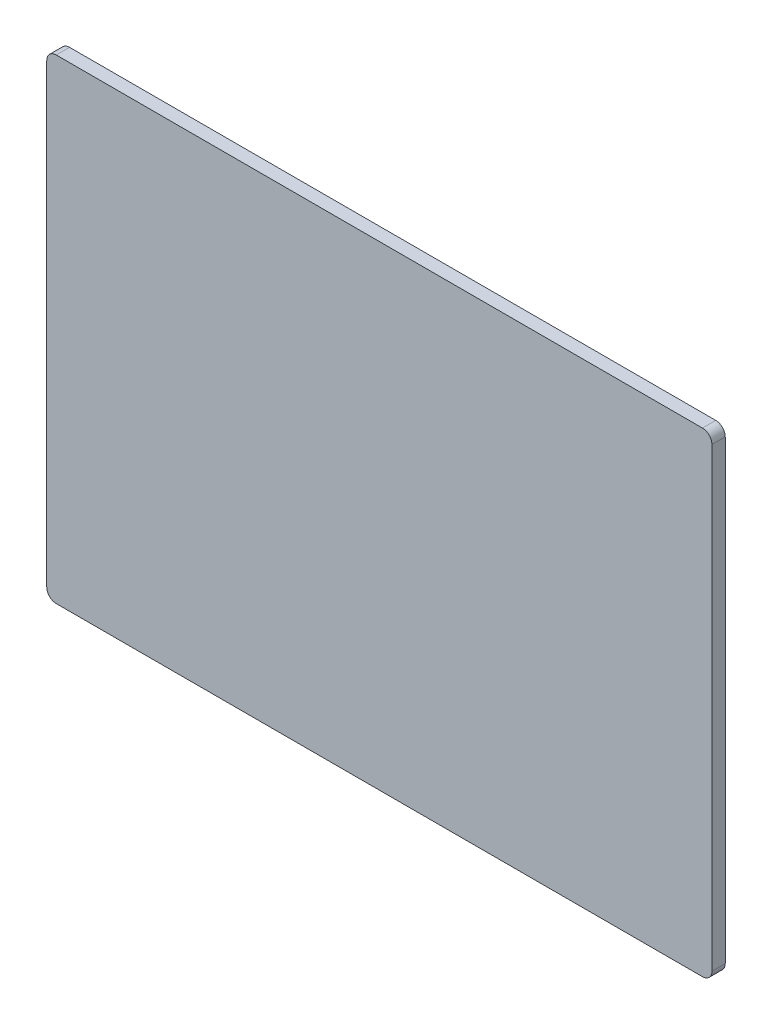
ISO-10303-21;
HEADER;
FILE_DESCRIPTION(('STEP AP214'),'2;1');
FILE_NAME('part.step','',(''),(''),'','','');
FILE_SCHEMA(('AUTOMOTIVE_DESIGN { 1 0 10303 214 1 1 1 1 }'));
ENDSEC;
DATA;
#1=APPLICATION_CONTEXT('core data for automotive mechanical design processes');
#2=APPLICATION_PROTOCOL_DEFINITION('international standard','automotive_design',2000,#1);
#3=PRODUCT_CONTEXT('',#1,'mechanical');
#4=PRODUCT('Part','Part','',(#3));
#5=PRODUCT_RELATED_PRODUCT_CATEGORY('part','',(#4));
#6=PRODUCT_DEFINITION_FORMATION('','',#4);
#7=PRODUCT_DEFINITION_CONTEXT('part definition',#1,'design');
#8=PRODUCT_DEFINITION('design','',#6,#7);
#9=PRODUCT_DEFINITION_SHAPE('','',#8);
#10=(LENGTH_UNIT() NAMED_UNIT(*) SI_UNIT(.MILLI.,.METRE.));
#11=(NAMED_UNIT(*) PLANE_ANGLE_UNIT() SI_UNIT($,.RADIAN.));
#12=(NAMED_UNIT(*) SI_UNIT($,.STERADIAN.) SOLID_ANGLE_UNIT());
#13=UNCERTAINTY_MEASURE_WITH_UNIT(LENGTH_MEASURE(1.E-05),#10,'distance_accuracy_value','');
#14=(GEOMETRIC_REPRESENTATION_CONTEXT(3) GLOBAL_UNCERTAINTY_ASSIGNED_CONTEXT((#13)) GLOBAL_UNIT_ASSIGNED_CONTEXT((#10,
#11,#12)) REPRESENTATION_CONTEXT('',''));
#15=CARTESIAN_POINT('',(0.,0.,0.));
#16=DIRECTION('',(0.,0.,1.));
#17=DIRECTION('',(1.,0.,0.));
#18=AXIS2_PLACEMENT_3D('',#15,#16,#17);
#19=CARTESIAN_POINT('',(-175.,-125.,7.));
#20=DIRECTION('',(1.,0.,0.));
#21=DIRECTION('',(0.,0.,-1.));
#22=AXIS2_PLACEMENT_3D('',#19,#20,#21);
#23=PLANE('',#22);
#24=DIRECTION('',(0.,-1.,0.));
#25=VECTOR('',#24,1.);
#26=CARTESIAN_POINT('',(-175.,-125.,0.));
#27=LINE('',#26,#25);
#28=CARTESIAN_POINT('',(-175.,120.,0.));
#29=VERTEX_POINT('',#28);
#30=CARTESIAN_POINT('',(-175.,-120.,0.));
#31=VERTEX_POINT('',#30);
#32=EDGE_CURVE('E127',#29,#31,#27,.T.);
#33=ORIENTED_EDGE('',*,*,#32,.T.);
#34=DIRECTION('',(0.,0.,-1.));
#35=VECTOR('',#34,1.);
#36=CARTESIAN_POINT('',(-175.,-120.,7.));
#37=LINE('',#36,#35);
#38=CARTESIAN_POINT('',(-175.,-120.,7.));
#39=VERTEX_POINT('',#38);
#40=EDGE_CURVE('E150',#31,#39,#37,.F.);
#41=ORIENTED_EDGE('',*,*,#40,.T.);
#42=DIRECTION('',(0.,-1.,0.));
#43=VECTOR('',#42,1.);
#44=CARTESIAN_POINT('',(-175.,-125.,7.));
#45=LINE('',#44,#43);
#46=CARTESIAN_POINT('',(-175.,120.,7.));
#47=VERTEX_POINT('',#46);
#48=EDGE_CURVE('E125',#47,#39,#45,.T.);
#49=ORIENTED_EDGE('',*,*,#48,.F.);
#50=DIRECTION('',(0.,0.,-1.));
#51=VECTOR('',#50,1.);
#52=CARTESIAN_POINT('',(-175.,120.,7.));
#53=LINE('',#52,#51);
#54=EDGE_CURVE('E147',#47,#29,#53,.T.);
#55=ORIENTED_EDGE('',*,*,#54,.T.);
#56=EDGE_LOOP('',(#33,#41,#49,#55));
#57=FACE_BOUND('',#56,.T.);
#58=ADVANCED_FACE('F32',(#57),#23,.F.);
#59=CARTESIAN_POINT('',(175.,-125.,7.));
#60=DIRECTION('',(0.,1.,0.));
#61=DIRECTION('',(-1.,0.,0.));
#62=AXIS2_PLACEMENT_3D('',#59,#60,#61);
#63=PLANE('',#62);
#64=DIRECTION('',(1.,0.,0.));
#65=VECTOR('',#64,1.);
#66=CARTESIAN_POINT('',(175.,-125.,0.));
#67=LINE('',#66,#65);
#68=CARTESIAN_POINT('',(-170.,-125.,0.));
#69=VERTEX_POINT('',#68);
#70=CARTESIAN_POINT('',(170.,-125.,0.));
#71=VERTEX_POINT('',#70);
#72=EDGE_CURVE('E123',#69,#71,#67,.T.);
#73=ORIENTED_EDGE('',*,*,#72,.T.);
#74=DIRECTION('',(0.,0.,-1.));
#75=VECTOR('',#74,1.);
#76=CARTESIAN_POINT('',(170.,-125.,7.));
#77=LINE('',#76,#75);
#78=CARTESIAN_POINT('',(170.,-125.,7.));
#79=VERTEX_POINT('',#78);
#80=EDGE_CURVE('E102',#71,#79,#77,.F.);
#81=ORIENTED_EDGE('',*,*,#80,.T.);
#82=DIRECTION('',(1.,0.,0.));
#83=VECTOR('',#82,1.);
#84=CARTESIAN_POINT('',(175.,-125.,7.));
#85=LINE('',#84,#83);
#86=CARTESIAN_POINT('',(-170.,-125.,7.));
#87=VERTEX_POINT('',#86);
#88=EDGE_CURVE('E166',#87,#79,#85,.T.);
#89=ORIENTED_EDGE('',*,*,#88,.F.);
#90=DIRECTION('',(0.,0.,-1.));
#91=VECTOR('',#90,1.);
#92=CARTESIAN_POINT('',(-170.,-125.,7.));
#93=LINE('',#92,#91);
#94=EDGE_CURVE('E107',#87,#69,#93,.T.);
#95=ORIENTED_EDGE('',*,*,#94,.T.);
#96=EDGE_LOOP('',(#73,#81,#89,#95));
#97=FACE_BOUND('',#96,.T.);
#98=ADVANCED_FACE('F183',(#97),#63,.F.);
#99=CARTESIAN_POINT('',(175.,-125.,7.));
#100=DIRECTION('',(-1.,0.,0.));
#101=DIRECTION('',(0.,0.,1.));
#102=AXIS2_PLACEMENT_3D('',#99,#100,#101);
#103=PLANE('',#102);
#104=DIRECTION('',(0.,1.,0.));
#105=VECTOR('',#104,1.);
#106=CARTESIAN_POINT('',(175.,-125.,7.));
#107=LINE('',#106,#105);
#108=CARTESIAN_POINT('',(175.,-120.,7.));
#109=VERTEX_POINT('',#108);
#110=CARTESIAN_POINT('',(175.,120.,7.));
#111=VERTEX_POINT('',#110);
#112=EDGE_CURVE('E116',#109,#111,#107,.T.);
#113=ORIENTED_EDGE('',*,*,#112,.F.);
#114=DIRECTION('',(0.,0.,-1.));
#115=VECTOR('',#114,1.);
#116=CARTESIAN_POINT('',(175.,-120.,7.));
#117=LINE('',#116,#115);
#118=CARTESIAN_POINT('',(175.,-120.,0.));
#119=VERTEX_POINT('',#118);
#120=EDGE_CURVE('E101',#109,#119,#117,.T.);
#121=ORIENTED_EDGE('',*,*,#120,.T.);
#122=DIRECTION('',(0.,1.,0.));
#123=VECTOR('',#122,1.);
#124=CARTESIAN_POINT('',(175.,-125.,0.));
#125=LINE('',#124,#123);
#126=CARTESIAN_POINT('',(175.,120.,0.));
#127=VERTEX_POINT('',#126);
#128=EDGE_CURVE('E114',#119,#127,#125,.T.);
#129=ORIENTED_EDGE('',*,*,#128,.T.);
#130=DIRECTION('',(0.,0.,-1.));
#131=VECTOR('',#130,1.);
#132=CARTESIAN_POINT('',(175.,120.,7.));
#133=LINE('',#132,#131);
#134=EDGE_CURVE('E118',#127,#111,#133,.F.);
#135=ORIENTED_EDGE('',*,*,#134,.T.);
#136=EDGE_LOOP('',(#113,#121,#129,#135));
#137=FACE_BOUND('',#136,.T.);
#138=ADVANCED_FACE('F113',(#137),#103,.F.);
#139=CARTESIAN_POINT('',(175.,125.,7.));
#140=DIRECTION('',(0.,-1.,0.));
#141=DIRECTION('',(1.,0.,0.));
#142=AXIS2_PLACEMENT_3D('',#139,#140,#141);
#143=PLANE('',#142);
#144=DIRECTION('',(-1.,0.,0.));
#145=VECTOR('',#144,1.);
#146=CARTESIAN_POINT('',(175.,125.,0.));
#147=LINE('',#146,#145);
#148=CARTESIAN_POINT('',(170.,125.,0.));
#149=VERTEX_POINT('',#148);
#150=CARTESIAN_POINT('',(-170.,125.,0.));
#151=VERTEX_POINT('',#150);
#152=EDGE_CURVE('E122',#149,#151,#147,.T.);
#153=ORIENTED_EDGE('',*,*,#152,.T.);
#154=DIRECTION('',(0.,0.,-1.));
#155=VECTOR('',#154,1.);
#156=CARTESIAN_POINT('',(-170.,125.,7.));
#157=LINE('',#156,#155);
#158=CARTESIAN_POINT('',(-170.,125.,7.));
#159=VERTEX_POINT('',#158);
#160=EDGE_CURVE('E11',#151,#159,#157,.F.);
#161=ORIENTED_EDGE('',*,*,#160,.T.);
#162=DIRECTION('',(-1.,0.,0.));
#163=VECTOR('',#162,1.);
#164=CARTESIAN_POINT('',(175.,125.,7.));
#165=LINE('',#164,#163);
#166=CARTESIAN_POINT('',(170.,125.,7.));
#167=VERTEX_POINT('',#166);
#168=EDGE_CURVE('E131',#167,#159,#165,.T.);
#169=ORIENTED_EDGE('',*,*,#168,.F.);
#170=DIRECTION('',(0.,0.,-1.));
#171=VECTOR('',#170,1.);
#172=CARTESIAN_POINT('',(170.,125.,7.));
#173=LINE('',#172,#171);
#174=EDGE_CURVE('E40',#167,#149,#173,.T.);
#175=ORIENTED_EDGE('',*,*,#174,.T.);
#176=EDGE_LOOP('',(#153,#161,#169,#175));
#177=FACE_BOUND('',#176,.T.);
#178=ADVANCED_FACE('F153',(#177),#143,.F.);
#179=CARTESIAN_POINT('',(0.,0.,7.));
#180=DIRECTION('',(0.,0.,1.));
#181=DIRECTION('',(1.,0.,0.));
#182=AXIS2_PLACEMENT_3D('',#179,#180,#181);
#183=PLANE('',#182);
#184=ORIENTED_EDGE('',*,*,#88,.T.);
#185=CARTESIAN_POINT('',(170.,-120.,7.));
#186=DIRECTION('',(0.,0.,1.));
#187=DIRECTION('',(1.,0.,0.));
#188=AXIS2_PLACEMENT_3D('',#185,#186,#187);
#189=CIRCLE('',#188,5.);
#190=EDGE_CURVE('E145',#79,#109,#189,.T.);
#191=ORIENTED_EDGE('',*,*,#190,.T.);
#192=ORIENTED_EDGE('',*,*,#112,.T.);
#193=CARTESIAN_POINT('',(170.,120.,7.));
#194=DIRECTION('',(0.,0.,1.));
#195=DIRECTION('',(1.,0.,0.));
#196=AXIS2_PLACEMENT_3D('',#193,#194,#195);
#197=CIRCLE('',#196,5.);
#198=EDGE_CURVE('E52',#111,#167,#197,.T.);
#199=ORIENTED_EDGE('',*,*,#198,.T.);
#200=ORIENTED_EDGE('',*,*,#168,.T.);
#201=CARTESIAN_POINT('',(-170.,120.,7.));
#202=DIRECTION('',(0.,0.,1.));
#203=DIRECTION('',(1.,0.,0.));
#204=AXIS2_PLACEMENT_3D('',#201,#202,#203);
#205=CIRCLE('',#204,5.);
#206=EDGE_CURVE('E141',#159,#47,#205,.T.);
#207=ORIENTED_EDGE('',*,*,#206,.T.);
#208=ORIENTED_EDGE('',*,*,#48,.T.);
#209=CARTESIAN_POINT('',(-170.,-120.,7.));
#210=DIRECTION('',(0.,0.,1.));
#211=DIRECTION('',(1.,0.,0.));
#212=AXIS2_PLACEMENT_3D('',#209,#210,#211);
#213=CIRCLE('',#212,5.);
#214=EDGE_CURVE('E143',#39,#87,#213,.T.);
#215=ORIENTED_EDGE('',*,*,#214,.T.);
#216=EDGE_LOOP('',(#184,#191,#192,#199,#200,#207,#208,#215));
#217=FACE_BOUND('',#216,.T.);
#218=ADVANCED_FACE('F172',(#217),#183,.T.);
#219=CARTESIAN_POINT('',(0.,0.,0.));
#220=DIRECTION('',(0.,0.,1.));
#221=DIRECTION('',(1.,0.,0.));
#222=AXIS2_PLACEMENT_3D('',#219,#220,#221);
#223=PLANE('',#222);
#224=ORIENTED_EDGE('',*,*,#128,.F.);
#225=CARTESIAN_POINT('',(170.,-120.,0.));
#226=DIRECTION('',(0.,0.,1.));
#227=DIRECTION('',(1.,0.,0.));
#228=AXIS2_PLACEMENT_3D('',#225,#226,#227);
#229=CIRCLE('',#228,5.);
#230=EDGE_CURVE('E97',#119,#71,#229,.F.);
#231=ORIENTED_EDGE('',*,*,#230,.T.);
#232=ORIENTED_EDGE('',*,*,#72,.F.);
#233=CARTESIAN_POINT('',(-170.,-120.,0.));
#234=DIRECTION('',(0.,0.,1.));
#235=DIRECTION('',(1.,0.,0.));
#236=AXIS2_PLACEMENT_3D('',#233,#234,#235);
#237=CIRCLE('',#236,5.);
#238=EDGE_CURVE('E108',#69,#31,#237,.F.);
#239=ORIENTED_EDGE('',*,*,#238,.T.);
#240=ORIENTED_EDGE('',*,*,#32,.F.);
#241=CARTESIAN_POINT('',(-170.,120.,0.));
#242=DIRECTION('',(0.,0.,1.));
#243=DIRECTION('',(1.,0.,0.));
#244=AXIS2_PLACEMENT_3D('',#241,#242,#243);
#245=CIRCLE('',#244,5.);
#246=EDGE_CURVE('E134',#29,#151,#245,.F.);
#247=ORIENTED_EDGE('',*,*,#246,.T.);
#248=ORIENTED_EDGE('',*,*,#152,.F.);
#249=CARTESIAN_POINT('',(170.,120.,0.));
#250=DIRECTION('',(0.,0.,1.));
#251=DIRECTION('',(1.,0.,0.));
#252=AXIS2_PLACEMENT_3D('',#249,#250,#251);
#253=CIRCLE('',#252,5.);
#254=EDGE_CURVE('E117',#149,#127,#253,.F.);
#255=ORIENTED_EDGE('',*,*,#254,.T.);
#256=EDGE_LOOP('',(#224,#231,#232,#239,#240,#247,#248,#255));
#257=FACE_BOUND('',#256,.T.);
#258=ADVANCED_FACE('F120',(#257),#223,.F.);
#259=CARTESIAN_POINT('',(170.,-120.,7.));
#260=DIRECTION('',(0.,0.,-1.));
#261=DIRECTION('',(-1.,0.,0.));
#262=AXIS2_PLACEMENT_3D('',#259,#260,#261);
#263=CYLINDRICAL_SURFACE('',#262,5.);
#264=ORIENTED_EDGE('',*,*,#190,.F.);
#265=ORIENTED_EDGE('',*,*,#80,.F.);
#266=ORIENTED_EDGE('',*,*,#230,.F.);
#267=ORIENTED_EDGE('',*,*,#120,.F.);
#268=EDGE_LOOP('',(#264,#265,#266,#267));
#269=FACE_BOUND('',#268,.T.);
#270=ADVANCED_FACE('F100',(#269),#263,.T.);
#271=CARTESIAN_POINT('',(-170.,-120.,7.));
#272=DIRECTION('',(0.,0.,-1.));
#273=DIRECTION('',(-1.,0.,0.));
#274=AXIS2_PLACEMENT_3D('',#271,#272,#273);
#275=CYLINDRICAL_SURFACE('',#274,5.);
#276=ORIENTED_EDGE('',*,*,#214,.F.);
#277=ORIENTED_EDGE('',*,*,#40,.F.);
#278=ORIENTED_EDGE('',*,*,#238,.F.);
#279=ORIENTED_EDGE('',*,*,#94,.F.);
#280=EDGE_LOOP('',(#276,#277,#278,#279));
#281=FACE_BOUND('',#280,.T.);
#282=ADVANCED_FACE('F194',(#281),#275,.T.);
#283=CARTESIAN_POINT('',(-170.,120.,7.));
#284=DIRECTION('',(0.,0.,-1.));
#285=DIRECTION('',(-1.,0.,0.));
#286=AXIS2_PLACEMENT_3D('',#283,#284,#285);
#287=CYLINDRICAL_SURFACE('',#286,5.);
#288=ORIENTED_EDGE('',*,*,#206,.F.);
#289=ORIENTED_EDGE('',*,*,#160,.F.);
#290=ORIENTED_EDGE('',*,*,#246,.F.);
#291=ORIENTED_EDGE('',*,*,#54,.F.);
#292=EDGE_LOOP('',(#288,#289,#290,#291));
#293=FACE_BOUND('',#292,.T.);
#294=ADVANCED_FACE('F160',(#293),#287,.T.);
#295=CARTESIAN_POINT('',(170.,120.,7.));
#296=DIRECTION('',(0.,0.,-1.));
#297=DIRECTION('',(-1.,0.,0.));
#298=AXIS2_PLACEMENT_3D('',#295,#296,#297);
#299=CYLINDRICAL_SURFACE('',#298,5.);
#300=ORIENTED_EDGE('',*,*,#198,.F.);
#301=ORIENTED_EDGE('',*,*,#134,.F.);
#302=ORIENTED_EDGE('',*,*,#254,.F.);
#303=ORIENTED_EDGE('',*,*,#174,.F.);
#304=EDGE_LOOP('',(#300,#301,#302,#303));
#305=FACE_BOUND('',#304,.T.);
#306=ADVANCED_FACE('F34',(#305),#299,.T.);
#307=CLOSED_SHELL('',(#58,#98,#138,#178,#218,#258,#270,#282,#294,#306));
#308=MANIFOLD_SOLID_BREP('B2',#307);
#309=ADVANCED_BREP_SHAPE_REPRESENTATION('',(#18,#308),#14);
#310=SHAPE_DEFINITION_REPRESENTATION(#9,#309);
ENDSEC;
END-ISO-10303-21;
